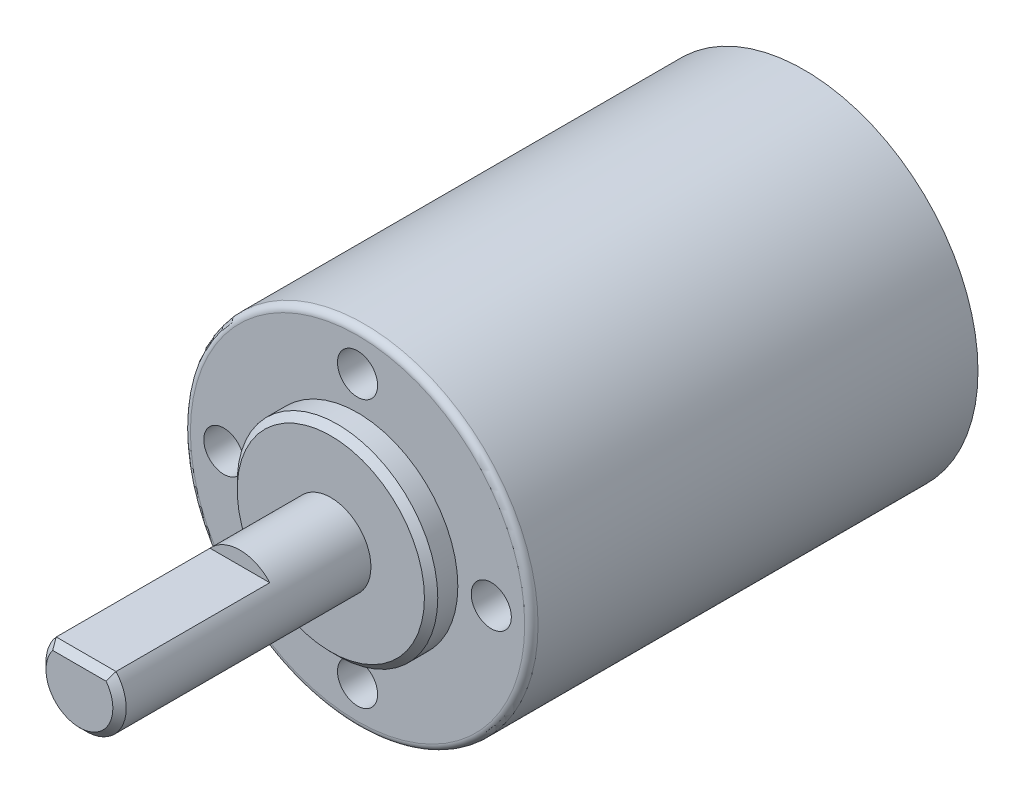
ISO-10303-21;
HEADER;
FILE_DESCRIPTION(('STEP AP214'),'2;1');
FILE_NAME('part.step','',(''),(''),'','','');
FILE_SCHEMA(('AUTOMOTIVE_DESIGN { 1 0 10303 214 1 1 1 1 }'));
ENDSEC;
DATA;
#1=APPLICATION_CONTEXT('core data for automotive mechanical design processes');
#2=APPLICATION_PROTOCOL_DEFINITION('international standard','automotive_design',2000,#1);
#3=PRODUCT_CONTEXT('',#1,'mechanical');
#4=PRODUCT('Part','Part','',(#3));
#5=PRODUCT_RELATED_PRODUCT_CATEGORY('part','',(#4));
#6=PRODUCT_DEFINITION_FORMATION('','',#4);
#7=PRODUCT_DEFINITION_CONTEXT('part definition',#1,'design');
#8=PRODUCT_DEFINITION('design','',#6,#7);
#9=PRODUCT_DEFINITION_SHAPE('','',#8);
#10=(LENGTH_UNIT() NAMED_UNIT(*) SI_UNIT(.MILLI.,.METRE.));
#11=(NAMED_UNIT(*) PLANE_ANGLE_UNIT() SI_UNIT($,.RADIAN.));
#12=(NAMED_UNIT(*) SI_UNIT($,.STERADIAN.) SOLID_ANGLE_UNIT());
#13=UNCERTAINTY_MEASURE_WITH_UNIT(LENGTH_MEASURE(1.E-05),#10,'distance_accuracy_value','');
#14=(GEOMETRIC_REPRESENTATION_CONTEXT(3) GLOBAL_UNCERTAINTY_ASSIGNED_CONTEXT((#13)) GLOBAL_UNIT_ASSIGNED_CONTEXT((#10,
#11,#12)) REPRESENTATION_CONTEXT('',''));
#15=CARTESIAN_POINT('',(0.,0.,0.));
#16=DIRECTION('',(0.,0.,1.));
#17=DIRECTION('',(1.,0.,0.));
#18=AXIS2_PLACEMENT_3D('',#15,#16,#17);
#19=CARTESIAN_POINT('',(0.,0.,35.4));
#20=DIRECTION('',(0.,0.,1.));
#21=DIRECTION('',(1.,0.,0.));
#22=AXIS2_PLACEMENT_3D('',#19,#20,#21);
#23=PLANE('',#22);
#24=CARTESIAN_POINT('',(0.,0.,35.4));
#25=DIRECTION('',(0.,0.,1.));
#26=DIRECTION('',(1.,0.,0.));
#27=AXIS2_PLACEMENT_3D('',#24,#25,#26);
#28=CIRCLE('',#27,7.);
#29=CARTESIAN_POINT('',(7.,0.,35.4));
#30=VERTEX_POINT('',#29);
#31=EDGE_CURVE('E95',#30,#30,#28,.T.);
#32=ORIENTED_EDGE('',*,*,#31,.T.);
#33=EDGE_LOOP('',(#32));
#34=FACE_BOUND('',#33,.T.);
#35=CARTESIAN_POINT('',(0.,0.,35.4));
#36=DIRECTION('',(0.,0.,1.));
#37=DIRECTION('',(1.,0.,0.));
#38=AXIS2_PLACEMENT_3D('',#35,#36,#37);
#39=CIRCLE('',#38,3.);
#40=CARTESIAN_POINT('',(3.,0.,35.4));
#41=VERTEX_POINT('',#40);
#42=EDGE_CURVE('E84',#41,#41,#39,.T.);
#43=ORIENTED_EDGE('',*,*,#42,.F.);
#44=EDGE_LOOP('',(#43));
#45=FACE_BOUND('',#44,.T.);
#46=ADVANCED_FACE('F31',(#34,#45),#23,.T.);
#47=CARTESIAN_POINT('',(0.,0.,33.4));
#48=DIRECTION('',(0.,0.,1.));
#49=DIRECTION('',(1.,0.,0.));
#50=AXIS2_PLACEMENT_3D('',#47,#48,#49);
#51=PLANE('',#50);
#52=CARTESIAN_POINT('',(0.,0.,33.4));
#53=DIRECTION('',(0.,0.,1.));
#54=DIRECTION('',(1.,0.,0.));
#55=AXIS2_PLACEMENT_3D('',#52,#53,#54);
#56=CIRCLE('',#55,12.5);
#57=CARTESIAN_POINT('',(12.5,0.,33.4));
#58=VERTEX_POINT('',#57);
#59=EDGE_CURVE('E39',#58,#58,#56,.T.);
#60=ORIENTED_EDGE('',*,*,#59,.T.);
#61=EDGE_LOOP('',(#60));
#62=FACE_BOUND('',#61,.T.);
#63=CARTESIAN_POINT('',(-10.,1.06846557681015E-13,33.4));
#64=DIRECTION('',(0.,0.,1.));
#65=DIRECTION('',(1.,0.,0.));
#66=AXIS2_PLACEMENT_3D('',#63,#64,#65);
#67=CIRCLE('',#66,1.5);
#68=CARTESIAN_POINT('',(-8.5,1.06846557681015E-13,33.4));
#69=VERTEX_POINT('',#68);
#70=EDGE_CURVE('E339',#69,#69,#67,.T.);
#71=ORIENTED_EDGE('',*,*,#70,.F.);
#72=EDGE_LOOP('',(#71));
#73=FACE_BOUND('',#72,.T.);
#74=CARTESIAN_POINT('',(2.82267768403989E-13,-10.,33.4));
#75=DIRECTION('',(0.,0.,1.));
#76=DIRECTION('',(1.,0.,0.));
#77=AXIS2_PLACEMENT_3D('',#74,#75,#76);
#78=CIRCLE('',#77,1.50000000000034);
#79=CARTESIAN_POINT('',(1.50000000000062,-10.,33.4));
#80=VERTEX_POINT('',#79);
#81=EDGE_CURVE('E333',#80,#80,#78,.T.);
#82=ORIENTED_EDGE('',*,*,#81,.F.);
#83=EDGE_LOOP('',(#82));
#84=FACE_BOUND('',#83,.T.);
#85=CARTESIAN_POINT('',(10.,0.,33.4));
#86=DIRECTION('',(0.,0.,1.));
#87=DIRECTION('',(1.,0.,0.));
#88=AXIS2_PLACEMENT_3D('',#85,#86,#87);
#89=CIRCLE('',#88,1.5);
#90=CARTESIAN_POINT('',(11.5,0.,33.4));
#91=VERTEX_POINT('',#90);
#92=EDGE_CURVE('E327',#91,#91,#89,.T.);
#93=ORIENTED_EDGE('',*,*,#92,.F.);
#94=EDGE_LOOP('',(#93));
#95=FACE_BOUND('',#94,.T.);
#96=CARTESIAN_POINT('',(0.,10.,33.4));
#97=DIRECTION('',(0.,0.,1.));
#98=DIRECTION('',(1.,0.,0.));
#99=AXIS2_PLACEMENT_3D('',#96,#97,#98);
#100=CIRCLE('',#99,1.5);
#101=CARTESIAN_POINT('',(1.5,10.,33.4));
#102=VERTEX_POINT('',#101);
#103=EDGE_CURVE('E321',#102,#102,#100,.T.);
#104=ORIENTED_EDGE('',*,*,#103,.F.);
#105=EDGE_LOOP('',(#104));
#106=FACE_BOUND('',#105,.T.);
#107=CARTESIAN_POINT('',(0.,0.,33.4));
#108=DIRECTION('',(0.,0.,1.));
#109=DIRECTION('',(1.,0.,0.));
#110=AXIS2_PLACEMENT_3D('',#107,#108,#109);
#111=CIRCLE('',#110,7.5);
#112=CARTESIAN_POINT('',(7.5,0.,33.4));
#113=VERTEX_POINT('',#112);
#114=EDGE_CURVE('E89',#113,#113,#111,.T.);
#115=ORIENTED_EDGE('',*,*,#114,.F.);
#116=EDGE_LOOP('',(#115));
#117=FACE_BOUND('',#116,.T.);
#118=ADVANCED_FACE('F136',(#62,#73,#84,#95,#106,#117),#51,.T.);
#119=CARTESIAN_POINT('',(0.,0.,33.4));
#120=DIRECTION('',(0.,0.,-1.));
#121=DIRECTION('',(-1.,0.,0.));
#122=AXIS2_PLACEMENT_3D('',#119,#120,#121);
#123=CYLINDRICAL_SURFACE('',#122,13.);
#124=CARTESIAN_POINT('',(0.,0.,32.9));
#125=DIRECTION('',(0.,0.,1.));
#126=DIRECTION('',(1.,0.,0.));
#127=AXIS2_PLACEMENT_3D('',#124,#125,#126);
#128=CIRCLE('',#127,13.);
#129=CARTESIAN_POINT('',(13.,0.,32.9));
#130=VERTEX_POINT('',#129);
#131=EDGE_CURVE('E11',#130,#130,#128,.F.);
#132=ORIENTED_EDGE('',*,*,#131,.T.);
#133=EDGE_LOOP('',(#132));
#134=FACE_BOUND('',#133,.T.);
#135=CARTESIAN_POINT('',(0.,0.,0.));
#136=DIRECTION('',(0.,0.,1.));
#137=DIRECTION('',(1.,0.,0.));
#138=AXIS2_PLACEMENT_3D('',#135,#136,#137);
#139=CIRCLE('',#138,13.);
#140=CARTESIAN_POINT('',(13.,0.,0.));
#141=VERTEX_POINT('',#140);
#142=EDGE_CURVE('E92',#141,#141,#139,.T.);
#143=ORIENTED_EDGE('',*,*,#142,.T.);
#144=EDGE_LOOP('',(#143));
#145=FACE_BOUND('',#144,.T.);
#146=ADVANCED_FACE('F142',(#134,#145),#123,.T.);
#147=CARTESIAN_POINT('',(0.,0.,0.));
#148=DIRECTION('',(0.,0.,1.));
#149=DIRECTION('',(1.,0.,0.));
#150=AXIS2_PLACEMENT_3D('',#147,#148,#149);
#151=PLANE('',#150);
#152=ORIENTED_EDGE('',*,*,#142,.F.);
#153=EDGE_LOOP('',(#152));
#154=FACE_BOUND('',#153,.T.);
#155=ADVANCED_FACE('F151',(#154),#151,.F.);
#156=CARTESIAN_POINT('',(0.,0.,35.4));
#157=DIRECTION('',(0.,0.,-1.));
#158=DIRECTION('',(-1.,0.,0.));
#159=AXIS2_PLACEMENT_3D('',#156,#157,#158);
#160=CYLINDRICAL_SURFACE('',#159,7.5);
#161=CARTESIAN_POINT('',(0.,0.,34.9));
#162=DIRECTION('',(0.,0.,1.));
#163=DIRECTION('',(1.,0.,0.));
#164=AXIS2_PLACEMENT_3D('',#161,#162,#163);
#165=CIRCLE('',#164,7.5);
#166=CARTESIAN_POINT('',(7.5,0.,34.9));
#167=VERTEX_POINT('',#166);
#168=EDGE_CURVE('E98',#167,#167,#165,.F.);
#169=ORIENTED_EDGE('',*,*,#168,.T.);
#170=EDGE_LOOP('',(#169));
#171=FACE_BOUND('',#170,.T.);
#172=ORIENTED_EDGE('',*,*,#114,.T.);
#173=EDGE_LOOP('',(#172));
#174=FACE_BOUND('',#173,.T.);
#175=ADVANCED_FACE('F149',(#171,#174),#160,.T.);
#176=CARTESIAN_POINT('',(0.,0.,54.2));
#177=DIRECTION('',(0.,0.,-1.));
#178=DIRECTION('',(-1.,0.,0.));
#179=AXIS2_PLACEMENT_3D('',#176,#177,#178);
#180=CYLINDRICAL_SURFACE('',#179,3.);
#181=DIRECTION('',(0.,0.,1.));
#182=VECTOR('',#181,1.);
#183=CARTESIAN_POINT('',(2.23606797749979,2.,42.2));
#184=LINE('',#183,#182);
#185=CARTESIAN_POINT('',(2.23606797749979,2.,42.2));
#186=VERTEX_POINT('',#185);
#187=CARTESIAN_POINT('',(2.23606797749979,2.,53.7));
#188=VERTEX_POINT('',#187);
#189=EDGE_CURVE('E77',#186,#188,#184,.T.);
#190=ORIENTED_EDGE('',*,*,#189,.T.);
#191=CARTESIAN_POINT('',(0.,0.,53.7));
#192=DIRECTION('',(0.,0.,1.));
#193=DIRECTION('',(1.,0.,0.));
#194=AXIS2_PLACEMENT_3D('',#191,#192,#193);
#195=CIRCLE('',#194,3.);
#196=CARTESIAN_POINT('',(-2.23606797749979,2.,53.7));
#197=VERTEX_POINT('',#196);
#198=EDGE_CURVE('E82',#188,#197,#195,.F.);
#199=ORIENTED_EDGE('',*,*,#198,.T.);
#200=DIRECTION('',(0.,0.,1.));
#201=VECTOR('',#200,1.);
#202=CARTESIAN_POINT('',(-2.23606797749979,2.,42.2));
#203=LINE('',#202,#201);
#204=CARTESIAN_POINT('',(-2.23606797749979,2.,42.2));
#205=VERTEX_POINT('',#204);
#206=EDGE_CURVE('E76',#205,#197,#203,.T.);
#207=ORIENTED_EDGE('',*,*,#206,.F.);
#208=CARTESIAN_POINT('',(0.,0.,42.2));
#209=DIRECTION('',(0.,0.,1.));
#210=DIRECTION('',(-1.,0.,0.));
#211=AXIS2_PLACEMENT_3D('',#208,#209,#210);
#212=CIRCLE('',#211,3.);
#213=EDGE_CURVE('E68',#186,#205,#212,.T.);
#214=ORIENTED_EDGE('',*,*,#213,.F.);
#215=EDGE_LOOP('',(#190,#199,#207,#214));
#216=FACE_BOUND('',#215,.T.);
#217=ORIENTED_EDGE('',*,*,#42,.T.);
#218=EDGE_LOOP('',(#217));
#219=FACE_BOUND('',#218,.T.);
#220=ADVANCED_FACE('F80',(#216,#219),#180,.T.);
#221=CARTESIAN_POINT('',(0.,0.,54.2));
#222=DIRECTION('',(0.,0.,1.));
#223=DIRECTION('',(1.,0.,0.));
#224=AXIS2_PLACEMENT_3D('',#221,#222,#223);
#225=PLANE('',#224);
#226=DIRECTION('',(-1.,0.,0.));
#227=VECTOR('',#226,1.);
#228=CARTESIAN_POINT('',(-2.23606797749979,1.49999999999999,54.2));
#229=LINE('',#228,#227);
#230=CARTESIAN_POINT('',(2.,1.49999999999999,54.2));
#231=VERTEX_POINT('',#230);
#232=CARTESIAN_POINT('',(-2.,1.49999999999999,54.2));
#233=VERTEX_POINT('',#232);
#234=EDGE_CURVE('E101',#231,#233,#229,.T.);
#235=ORIENTED_EDGE('',*,*,#234,.T.);
#236=CARTESIAN_POINT('',(0.,0.,54.2));
#237=DIRECTION('',(0.,0.,1.));
#238=DIRECTION('',(1.,0.,0.));
#239=AXIS2_PLACEMENT_3D('',#236,#237,#238);
#240=CIRCLE('',#239,2.49999999999999);
#241=EDGE_CURVE('E103',#233,#231,#240,.T.);
#242=ORIENTED_EDGE('',*,*,#241,.T.);
#243=EDGE_LOOP('',(#235,#242));
#244=FACE_BOUND('',#243,.T.);
#245=ADVANCED_FACE('F174',(#244),#225,.T.);
#246=CARTESIAN_POINT('',(-2.23606797749979,2.,42.2));
#247=DIRECTION('',(0.,-1.,0.));
#248=DIRECTION('',(0.,0.,-1.));
#249=AXIS2_PLACEMENT_3D('',#246,#247,#248);
#250=PLANE('',#249);
#251=ORIENTED_EDGE('',*,*,#206,.T.);
#252=DIRECTION('',(1.,0.,0.));
#253=VECTOR('',#252,1.);
#254=CARTESIAN_POINT('',(2.23606797749979,2.,53.7));
#255=LINE('',#254,#253);
#256=EDGE_CURVE('E46',#197,#188,#255,.T.);
#257=ORIENTED_EDGE('',*,*,#256,.T.);
#258=ORIENTED_EDGE('',*,*,#189,.F.);
#259=DIRECTION('',(1.,0.,0.));
#260=VECTOR('',#259,1.);
#261=CARTESIAN_POINT('',(-2.23606797749979,2.,42.2));
#262=LINE('',#261,#260);
#263=EDGE_CURVE('E71',#205,#186,#262,.T.);
#264=ORIENTED_EDGE('',*,*,#263,.F.);
#265=EDGE_LOOP('',(#251,#257,#258,#264));
#266=FACE_BOUND('',#265,.T.);
#267=ADVANCED_FACE('F75',(#266),#250,.F.);
#268=CARTESIAN_POINT('',(0.,0.,42.2));
#269=DIRECTION('',(0.,0.,-1.));
#270=DIRECTION('',(-1.,0.,0.));
#271=AXIS2_PLACEMENT_3D('',#268,#269,#270);
#272=PLANE('',#271);
#273=ORIENTED_EDGE('',*,*,#213,.T.);
#274=ORIENTED_EDGE('',*,*,#263,.T.);
#275=EDGE_LOOP('',(#273,#274));
#276=FACE_BOUND('',#275,.T.);
#277=ADVANCED_FACE('F70',(#276),#272,.F.);
#278=CARTESIAN_POINT('',(0.,0.,35.4));
#279=DIRECTION('',(0.,0.,-1.));
#280=DIRECTION('',(-1.,0.,0.));
#281=AXIS2_PLACEMENT_3D('',#278,#279,#280);
#282=CONICAL_SURFACE('',#281,7.,0.785398163397435);
#283=ORIENTED_EDGE('',*,*,#168,.F.);
#284=EDGE_LOOP('',(#283));
#285=FACE_BOUND('',#284,.T.);
#286=ORIENTED_EDGE('',*,*,#31,.F.);
#287=EDGE_LOOP('',(#286));
#288=FACE_BOUND('',#287,.T.);
#289=ADVANCED_FACE('F133',(#285,#288),#282,.T.);
#290=CARTESIAN_POINT('',(-2.23606797749979,2.,53.7));
#291=DIRECTION('',(0.,0.707106781186547,0.707106781186547));
#292=DIRECTION('',(0.,-0.707106781186548,0.707106781186548));
#293=AXIS2_PLACEMENT_3D('',#290,#291,#292);
#294=PLANE('',#293);
#295=CARTESIAN_POINT('',(2.,1.49999999999999,54.2));
#296=CARTESIAN_POINT('',(2.02070857912985,1.54141920229522,54.1585807977048));
#297=CARTESIAN_POINT('',(2.04113293454125,1.58290914404845,54.1170908559515));
#298=CARTESIAN_POINT('',(2.08145061491556,1.6660146344085,54.0339853655915));
#299=CARTESIAN_POINT('',(2.10134397696905,1.70763017401492,53.9923698259851));
#300=CARTESIAN_POINT('',(2.14063967558382,1.79097615311456,53.9090238468854));
#301=CARTESIAN_POINT('',(2.16004201968289,1.83270659083302,53.867293409167));
#302=CARTESIAN_POINT('',(2.19838987344755,1.91627554896634,53.7837244510336));
#303=CARTESIAN_POINT('',(2.21733535103478,1.95811407674361,53.7418859232564));
#304=CARTESIAN_POINT('',(2.23606797749979,2.,53.7));
#305=B_SPLINE_CURVE_WITH_KNOTS('',3,(#295,#296,#297,#298,#299,#300,#301,#302,#303,#304),
.UNSPECIFIED.,.F.,.F.,(4,2,2,2,4),(0.,0.186384056083047,0.372755058743477,0.559123198618559,
0.745504386246822),.UNSPECIFIED.);
#306=EDGE_CURVE('E108',#188,#231,#305,.F.);
#307=ORIENTED_EDGE('',*,*,#306,.F.);
#308=ORIENTED_EDGE('',*,*,#256,.F.);
#309=CARTESIAN_POINT('',(-2.23606797749979,2.,53.7));
#310=CARTESIAN_POINT('',(-2.21733535103477,1.95811407674361,53.7418859232564));
#311=CARTESIAN_POINT('',(-2.19838987344755,1.91627554896634,53.7837244510337));
#312=CARTESIAN_POINT('',(-2.16004201968289,1.83270659083301,53.867293409167));
#313=CARTESIAN_POINT('',(-2.14063967558382,1.79097615311455,53.9090238468854));
#314=CARTESIAN_POINT('',(-2.10134397696905,1.70763017401492,53.9923698259851));
#315=CARTESIAN_POINT('',(-2.08145061491556,1.6660146344085,54.0339853655915));
#316=CARTESIAN_POINT('',(-2.04113293454125,1.58290914404846,54.1170908559515));
#317=CARTESIAN_POINT('',(-2.02070857912985,1.54141920229522,54.1585807977048));
#318=CARTESIAN_POINT('',(-2.,1.49999999999999,54.2));
#319=B_SPLINE_CURVE_WITH_KNOTS('',3,(#309,#310,#311,#312,#313,#314,#315,#316,#317,#318),
.UNSPECIFIED.,.F.,.F.,(4,2,2,2,4),(0.,0.186381187628271,0.372749327503347,0.559120330163766,
0.745504386246822),.UNSPECIFIED.);
#320=EDGE_CURVE('E54',#233,#197,#319,.F.);
#321=ORIENTED_EDGE('',*,*,#320,.F.);
#322=ORIENTED_EDGE('',*,*,#234,.F.);
#323=EDGE_LOOP('',(#307,#308,#321,#322));
#324=FACE_BOUND('',#323,.T.);
#325=ADVANCED_FACE('F118',(#324),#294,.T.);
#326=CARTESIAN_POINT('',(0.,0.,54.2));
#327=DIRECTION('',(0.,0.,-1.));
#328=DIRECTION('',(-1.,0.,0.));
#329=AXIS2_PLACEMENT_3D('',#326,#327,#328);
#330=CONICAL_SURFACE('',#329,2.49999999999999,0.785398163397448);
#331=ORIENTED_EDGE('',*,*,#320,.T.);
#332=ORIENTED_EDGE('',*,*,#198,.F.);
#333=ORIENTED_EDGE('',*,*,#306,.T.);
#334=ORIENTED_EDGE('',*,*,#241,.F.);
#335=EDGE_LOOP('',(#331,#332,#333,#334));
#336=FACE_BOUND('',#335,.T.);
#337=ADVANCED_FACE('F121',(#336),#330,.T.);
#338=CARTESIAN_POINT('',(0.,10.,28.4));
#339=DIRECTION('',(0.,0.,1.));
#340=DIRECTION('',(1.,0.,0.));
#341=AXIS2_PLACEMENT_3D('',#338,#339,#340);
#342=CYLINDRICAL_SURFACE('',#341,1.5);
#343=CARTESIAN_POINT('',(0.,10.,28.4));
#344=DIRECTION('',(0.,0.,1.));
#345=DIRECTION('',(1.,0.,0.));
#346=AXIS2_PLACEMENT_3D('',#343,#344,#345);
#347=CIRCLE('',#346,1.5);
#348=CARTESIAN_POINT('',(1.5,10.,28.4));
#349=VERTEX_POINT('',#348);
#350=EDGE_CURVE('E114',#349,#349,#347,.T.);
#351=ORIENTED_EDGE('',*,*,#350,.F.);
#352=EDGE_LOOP('',(#351));
#353=FACE_BOUND('',#352,.T.);
#354=ORIENTED_EDGE('',*,*,#103,.T.);
#355=EDGE_LOOP('',(#354));
#356=FACE_BOUND('',#355,.T.);
#357=ADVANCED_FACE('F124',(#353,#356),#342,.F.);
#358=CARTESIAN_POINT('',(0.,10.,28.4));
#359=DIRECTION('',(0.,0.,1.));
#360=DIRECTION('',(1.,0.,0.));
#361=AXIS2_PLACEMENT_3D('',#358,#359,#360);
#362=PLANE('',#361);
#363=ORIENTED_EDGE('',*,*,#350,.T.);
#364=EDGE_LOOP('',(#363));
#365=FACE_BOUND('',#364,.T.);
#366=ADVANCED_FACE('F130',(#365),#362,.T.);
#367=CARTESIAN_POINT('',(10.,0.,28.4));
#368=DIRECTION('',(0.,0.,1.));
#369=DIRECTION('',(1.,0.,0.));
#370=AXIS2_PLACEMENT_3D('',#367,#368,#369);
#371=CYLINDRICAL_SURFACE('',#370,1.5);
#372=CARTESIAN_POINT('',(10.,0.,28.4));
#373=DIRECTION('',(0.,0.,1.));
#374=DIRECTION('',(1.,0.,0.));
#375=AXIS2_PLACEMENT_3D('',#372,#373,#374);
#376=CIRCLE('',#375,1.5);
#377=CARTESIAN_POINT('',(11.5,0.,28.4));
#378=VERTEX_POINT('',#377);
#379=EDGE_CURVE('E324',#378,#378,#376,.T.);
#380=ORIENTED_EDGE('',*,*,#379,.F.);
#381=EDGE_LOOP('',(#380));
#382=FACE_BOUND('',#381,.T.);
#383=ORIENTED_EDGE('',*,*,#92,.T.);
#384=EDGE_LOOP('',(#383));
#385=FACE_BOUND('',#384,.T.);
#386=ADVANCED_FACE('F255',(#382,#385),#371,.F.);
#387=CARTESIAN_POINT('',(10.,0.,28.4));
#388=DIRECTION('',(0.,0.,1.));
#389=DIRECTION('',(1.,0.,0.));
#390=AXIS2_PLACEMENT_3D('',#387,#388,#389);
#391=PLANE('',#390);
#392=ORIENTED_EDGE('',*,*,#379,.T.);
#393=EDGE_LOOP('',(#392));
#394=FACE_BOUND('',#393,.T.);
#395=ADVANCED_FACE('F245',(#394),#391,.T.);
#396=CARTESIAN_POINT('',(2.82267768403989E-13,-10.,28.4));
#397=DIRECTION('',(0.,0.,1.));
#398=DIRECTION('',(1.,0.,0.));
#399=AXIS2_PLACEMENT_3D('',#396,#397,#398);
#400=CYLINDRICAL_SURFACE('',#399,1.50000000000034);
#401=CARTESIAN_POINT('',(2.82267768403989E-13,-10.,28.4));
#402=DIRECTION('',(0.,0.,1.));
#403=DIRECTION('',(1.,0.,0.));
#404=AXIS2_PLACEMENT_3D('',#401,#402,#403);
#405=CIRCLE('',#404,1.50000000000034);
#406=CARTESIAN_POINT('',(1.50000000000062,-10.,28.4));
#407=VERTEX_POINT('',#406);
#408=EDGE_CURVE('E330',#407,#407,#405,.T.);
#409=ORIENTED_EDGE('',*,*,#408,.F.);
#410=EDGE_LOOP('',(#409));
#411=FACE_BOUND('',#410,.T.);
#412=ORIENTED_EDGE('',*,*,#81,.T.);
#413=EDGE_LOOP('',(#412));
#414=FACE_BOUND('',#413,.T.);
#415=ADVANCED_FACE('F235',(#411,#414),#400,.F.);
#416=CARTESIAN_POINT('',(2.82267768403989E-13,-10.,28.4));
#417=DIRECTION('',(0.,0.,1.));
#418=DIRECTION('',(1.,0.,0.));
#419=AXIS2_PLACEMENT_3D('',#416,#417,#418);
#420=PLANE('',#419);
#421=ORIENTED_EDGE('',*,*,#408,.T.);
#422=EDGE_LOOP('',(#421));
#423=FACE_BOUND('',#422,.T.);
#424=ADVANCED_FACE('F225',(#423),#420,.T.);
#425=CARTESIAN_POINT('',(-10.,1.06846557681015E-13,28.4));
#426=DIRECTION('',(0.,0.,1.));
#427=DIRECTION('',(1.,0.,0.));
#428=AXIS2_PLACEMENT_3D('',#425,#426,#427);
#429=CYLINDRICAL_SURFACE('',#428,1.5);
#430=CARTESIAN_POINT('',(-10.,1.06846557681015E-13,28.4));
#431=DIRECTION('',(0.,0.,1.));
#432=DIRECTION('',(1.,0.,0.));
#433=AXIS2_PLACEMENT_3D('',#430,#431,#432);
#434=CIRCLE('',#433,1.5);
#435=CARTESIAN_POINT('',(-8.5,1.06846557681015E-13,28.4));
#436=VERTEX_POINT('',#435);
#437=EDGE_CURVE('E336',#436,#436,#434,.T.);
#438=ORIENTED_EDGE('',*,*,#437,.F.);
#439=EDGE_LOOP('',(#438));
#440=FACE_BOUND('',#439,.T.);
#441=ORIENTED_EDGE('',*,*,#70,.T.);
#442=EDGE_LOOP('',(#441));
#443=FACE_BOUND('',#442,.T.);
#444=ADVANCED_FACE('F213',(#440,#443),#429,.F.);
#445=CARTESIAN_POINT('',(-10.,1.06846557681015E-13,28.4));
#446=DIRECTION('',(0.,0.,1.));
#447=DIRECTION('',(1.,0.,0.));
#448=AXIS2_PLACEMENT_3D('',#445,#446,#447);
#449=PLANE('',#448);
#450=ORIENTED_EDGE('',*,*,#437,.T.);
#451=EDGE_LOOP('',(#450));
#452=FACE_BOUND('',#451,.T.);
#453=ADVANCED_FACE('F208',(#452),#449,.T.);
#454=CARTESIAN_POINT('',(0.,0.,32.9));
#455=DIRECTION('',(0.,0.,1.));
#456=DIRECTION('',(1.,0.,0.));
#457=AXIS2_PLACEMENT_3D('',#454,#455,#456);
#458=TOROIDAL_SURFACE('',#457,12.5,0.5);
#459=ORIENTED_EDGE('',*,*,#131,.F.);
#460=EDGE_LOOP('',(#459));
#461=FACE_BOUND('',#460,.T.);
#462=ORIENTED_EDGE('',*,*,#59,.F.);
#463=EDGE_LOOP('',(#462));
#464=FACE_BOUND('',#463,.T.);
#465=ADVANCED_FACE('F33',(#461,#464),#458,.T.);
#466=CLOSED_SHELL('',(#46,#118,#146,#155,#175,#220,#245,#267,#277,#289,#325,#337,#357,#366,#386,
#395,#415,#424,#444,#453,#465));
#467=MANIFOLD_SOLID_BREP('B2',#466);
#468=ADVANCED_BREP_SHAPE_REPRESENTATION('',(#18,#467),#14);
#469=SHAPE_DEFINITION_REPRESENTATION(#9,#468);
ENDSEC;
END-ISO-10303-21;
